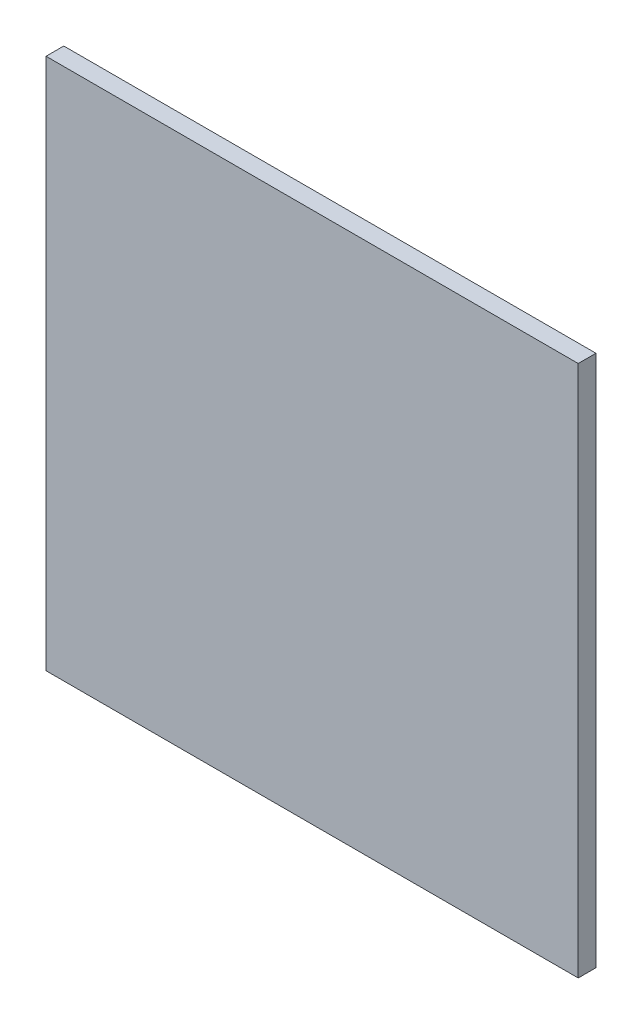
ISO-10303-21;
HEADER;
FILE_DESCRIPTION(('STEP AP214'),'2;1');
FILE_NAME('part.step','',(''),(''),'','','');
FILE_SCHEMA(('AUTOMOTIVE_DESIGN { 1 0 10303 214 1 1 1 1 }'));
ENDSEC;
DATA;
#1=APPLICATION_CONTEXT('core data for automotive mechanical design processes');
#2=APPLICATION_PROTOCOL_DEFINITION('international standard','automotive_design',2000,#1);
#3=PRODUCT_CONTEXT('',#1,'mechanical');
#4=PRODUCT('Part','Part','',(#3));
#5=PRODUCT_RELATED_PRODUCT_CATEGORY('part','',(#4));
#6=PRODUCT_DEFINITION_FORMATION('','',#4);
#7=PRODUCT_DEFINITION_CONTEXT('part definition',#1,'design');
#8=PRODUCT_DEFINITION('design','',#6,#7);
#9=PRODUCT_DEFINITION_SHAPE('','',#8);
#10=(LENGTH_UNIT() NAMED_UNIT(*) SI_UNIT(.MILLI.,.METRE.));
#11=(NAMED_UNIT(*) PLANE_ANGLE_UNIT() SI_UNIT($,.RADIAN.));
#12=(NAMED_UNIT(*) SI_UNIT($,.STERADIAN.) SOLID_ANGLE_UNIT());
#13=UNCERTAINTY_MEASURE_WITH_UNIT(LENGTH_MEASURE(1.E-05),#10,'distance_accuracy_value','');
#14=(GEOMETRIC_REPRESENTATION_CONTEXT(3) GLOBAL_UNCERTAINTY_ASSIGNED_CONTEXT((#13)) GLOBAL_UNIT_ASSIGNED_CONTEXT((#10,
#11,#12)) REPRESENTATION_CONTEXT('',''));
#15=CARTESIAN_POINT('',(0.,0.,0.));
#16=DIRECTION('',(0.,0.,1.));
#17=DIRECTION('',(1.,0.,0.));
#18=AXIS2_PLACEMENT_3D('',#15,#16,#17);
#19=CARTESIAN_POINT('',(-79.217468410552,-223.342939481268,10.));
#20=DIRECTION('',(1.,0.,0.));
#21=DIRECTION('',(0.,0.,-1.));
#22=AXIS2_PLACEMENT_3D('',#19,#20,#21);
#23=PLANE('',#22);
#24=DIRECTION('',(0.,-1.,0.));
#25=VECTOR('',#24,1.);
#26=CARTESIAN_POINT('',(-79.217468410552,-223.342939481268,0.));
#27=LINE('',#26,#25);
#28=CARTESIAN_POINT('',(-79.217468410552,76.6570605187321,0.));
#29=VERTEX_POINT('',#28);
#30=CARTESIAN_POINT('',(-79.217468410552,-223.342939481268,0.));
#31=VERTEX_POINT('',#30);
#32=EDGE_CURVE('E109',#29,#31,#27,.T.);
#33=ORIENTED_EDGE('',*,*,#32,.T.);
#34=DIRECTION('',(0.,0.,-1.));
#35=VECTOR('',#34,1.);
#36=CARTESIAN_POINT('',(-79.217468410552,-223.342939481268,10.));
#37=LINE('',#36,#35);
#38=CARTESIAN_POINT('',(-79.217468410552,-223.342939481268,10.));
#39=VERTEX_POINT('',#38);
#40=EDGE_CURVE('E11',#39,#31,#37,.T.);
#41=ORIENTED_EDGE('',*,*,#40,.F.);
#42=DIRECTION('',(0.,-1.,0.));
#43=VECTOR('',#42,1.);
#44=CARTESIAN_POINT('',(-79.217468410552,-223.342939481268,10.));
#45=LINE('',#44,#43);
#46=CARTESIAN_POINT('',(-79.217468410552,76.6570605187321,10.));
#47=VERTEX_POINT('',#46);
#48=EDGE_CURVE('E93',#47,#39,#45,.T.);
#49=ORIENTED_EDGE('',*,*,#48,.F.);
#50=DIRECTION('',(0.,0.,-1.));
#51=VECTOR('',#50,1.);
#52=CARTESIAN_POINT('',(-79.217468410552,76.6570605187321,10.));
#53=LINE('',#52,#51);
#54=EDGE_CURVE('E105',#47,#29,#53,.T.);
#55=ORIENTED_EDGE('',*,*,#54,.T.);
#56=EDGE_LOOP('',(#33,#41,#49,#55));
#57=FACE_BOUND('',#56,.T.);
#58=ADVANCED_FACE('F41',(#57),#23,.F.);
#59=CARTESIAN_POINT('',(220.782531589448,-223.342939481268,10.));
#60=DIRECTION('',(0.,1.,0.));
#61=DIRECTION('',(-1.,0.,0.));
#62=AXIS2_PLACEMENT_3D('',#59,#60,#61);
#63=PLANE('',#62);
#64=DIRECTION('',(1.,0.,0.));
#65=VECTOR('',#64,1.);
#66=CARTESIAN_POINT('',(220.782531589448,-223.342939481268,0.));
#67=LINE('',#66,#65);
#68=CARTESIAN_POINT('',(220.782531589448,-223.342939481268,0.));
#69=VERTEX_POINT('',#68);
#70=EDGE_CURVE('E98',#31,#69,#67,.T.);
#71=ORIENTED_EDGE('',*,*,#70,.T.);
#72=DIRECTION('',(0.,0.,-1.));
#73=VECTOR('',#72,1.);
#74=CARTESIAN_POINT('',(220.782531589448,-223.342939481268,10.));
#75=LINE('',#74,#73);
#76=CARTESIAN_POINT('',(220.782531589448,-223.342939481268,10.));
#77=VERTEX_POINT('',#76);
#78=EDGE_CURVE('E50',#77,#69,#75,.T.);
#79=ORIENTED_EDGE('',*,*,#78,.F.);
#80=DIRECTION('',(1.,0.,0.));
#81=VECTOR('',#80,1.);
#82=CARTESIAN_POINT('',(220.782531589448,-223.342939481268,10.));
#83=LINE('',#82,#81);
#84=EDGE_CURVE('E88',#39,#77,#83,.T.);
#85=ORIENTED_EDGE('',*,*,#84,.F.);
#86=ORIENTED_EDGE('',*,*,#40,.T.);
#87=EDGE_LOOP('',(#71,#79,#85,#86));
#88=FACE_BOUND('',#87,.T.);
#89=ADVANCED_FACE('F97',(#88),#63,.F.);
#90=CARTESIAN_POINT('',(220.782531589448,76.6570605187321,10.));
#91=DIRECTION('',(-1.,0.,0.));
#92=DIRECTION('',(0.,-1.,0.));
#93=AXIS2_PLACEMENT_3D('',#90,#91,#92);
#94=PLANE('',#93);
#95=DIRECTION('',(0.,1.,0.));
#96=VECTOR('',#95,1.);
#97=CARTESIAN_POINT('',(220.782531589448,76.6570605187321,0.));
#98=LINE('',#97,#96);
#99=CARTESIAN_POINT('',(220.782531589448,76.6570605187321,0.));
#100=VERTEX_POINT('',#99);
#101=EDGE_CURVE('E75',#69,#100,#98,.T.);
#102=ORIENTED_EDGE('',*,*,#101,.T.);
#103=DIRECTION('',(0.,0.,-1.));
#104=VECTOR('',#103,1.);
#105=CARTESIAN_POINT('',(220.782531589448,76.6570605187321,10.));
#106=LINE('',#105,#104);
#107=CARTESIAN_POINT('',(220.782531589448,76.6570605187321,10.));
#108=VERTEX_POINT('',#107);
#109=EDGE_CURVE('E100',#108,#100,#106,.T.);
#110=ORIENTED_EDGE('',*,*,#109,.F.);
#111=DIRECTION('',(0.,1.,0.));
#112=VECTOR('',#111,1.);
#113=CARTESIAN_POINT('',(220.782531589448,76.6570605187321,10.));
#114=LINE('',#113,#112);
#115=EDGE_CURVE('E91',#77,#108,#114,.T.);
#116=ORIENTED_EDGE('',*,*,#115,.F.);
#117=ORIENTED_EDGE('',*,*,#78,.T.);
#118=EDGE_LOOP('',(#102,#110,#116,#117));
#119=FACE_BOUND('',#118,.T.);
#120=ADVANCED_FACE('F101',(#119),#94,.F.);
#121=CARTESIAN_POINT('',(-79.217468410552,76.6570605187321,10.));
#122=DIRECTION('',(0.,-1.,0.));
#123=DIRECTION('',(0.,0.,-1.));
#124=AXIS2_PLACEMENT_3D('',#121,#122,#123);
#125=PLANE('',#124);
#126=DIRECTION('',(-1.,0.,0.));
#127=VECTOR('',#126,1.);
#128=CARTESIAN_POINT('',(-79.217468410552,76.6570605187321,0.));
#129=LINE('',#128,#127);
#130=EDGE_CURVE('E81',#100,#29,#129,.T.);
#131=ORIENTED_EDGE('',*,*,#130,.T.);
#132=ORIENTED_EDGE('',*,*,#54,.F.);
#133=DIRECTION('',(-1.,0.,0.));
#134=VECTOR('',#133,1.);
#135=CARTESIAN_POINT('',(-79.217468410552,76.6570605187321,10.));
#136=LINE('',#135,#134);
#137=EDGE_CURVE('E58',#108,#47,#136,.T.);
#138=ORIENTED_EDGE('',*,*,#137,.F.);
#139=ORIENTED_EDGE('',*,*,#109,.T.);
#140=EDGE_LOOP('',(#131,#132,#138,#139));
#141=FACE_BOUND('',#140,.T.);
#142=ADVANCED_FACE('F122',(#141),#125,.F.);
#143=CARTESIAN_POINT('',(0.,0.,10.));
#144=DIRECTION('',(0.,0.,-1.));
#145=DIRECTION('',(-1.,0.,0.));
#146=AXIS2_PLACEMENT_3D('',#143,#144,#145);
#147=PLANE('',#146);
#148=ORIENTED_EDGE('',*,*,#48,.T.);
#149=ORIENTED_EDGE('',*,*,#84,.T.);
#150=ORIENTED_EDGE('',*,*,#115,.T.);
#151=ORIENTED_EDGE('',*,*,#137,.T.);
#152=EDGE_LOOP('',(#148,#149,#150,#151));
#153=FACE_BOUND('',#152,.T.);
#154=ADVANCED_FACE('F89',(#153),#147,.F.);
#155=CARTESIAN_POINT('',(0.,0.,0.));
#156=DIRECTION('',(0.,0.,-1.));
#157=DIRECTION('',(-1.,0.,0.));
#158=AXIS2_PLACEMENT_3D('',#155,#156,#157);
#159=PLANE('',#158);
#160=ORIENTED_EDGE('',*,*,#32,.F.);
#161=ORIENTED_EDGE('',*,*,#130,.F.);
#162=ORIENTED_EDGE('',*,*,#101,.F.);
#163=ORIENTED_EDGE('',*,*,#70,.F.);
#164=EDGE_LOOP('',(#160,#161,#162,#163));
#165=FACE_BOUND('',#164,.T.);
#166=ADVANCED_FACE('F125',(#165),#159,.T.);
#167=CLOSED_SHELL('',(#58,#89,#120,#142,#154,#166));
#168=MANIFOLD_SOLID_BREP('B2',#167);
#169=ADVANCED_BREP_SHAPE_REPRESENTATION('',(#18,#168),#14);
#170=SHAPE_DEFINITION_REPRESENTATION(#9,#169);
ENDSEC;
END-ISO-10303-21;
